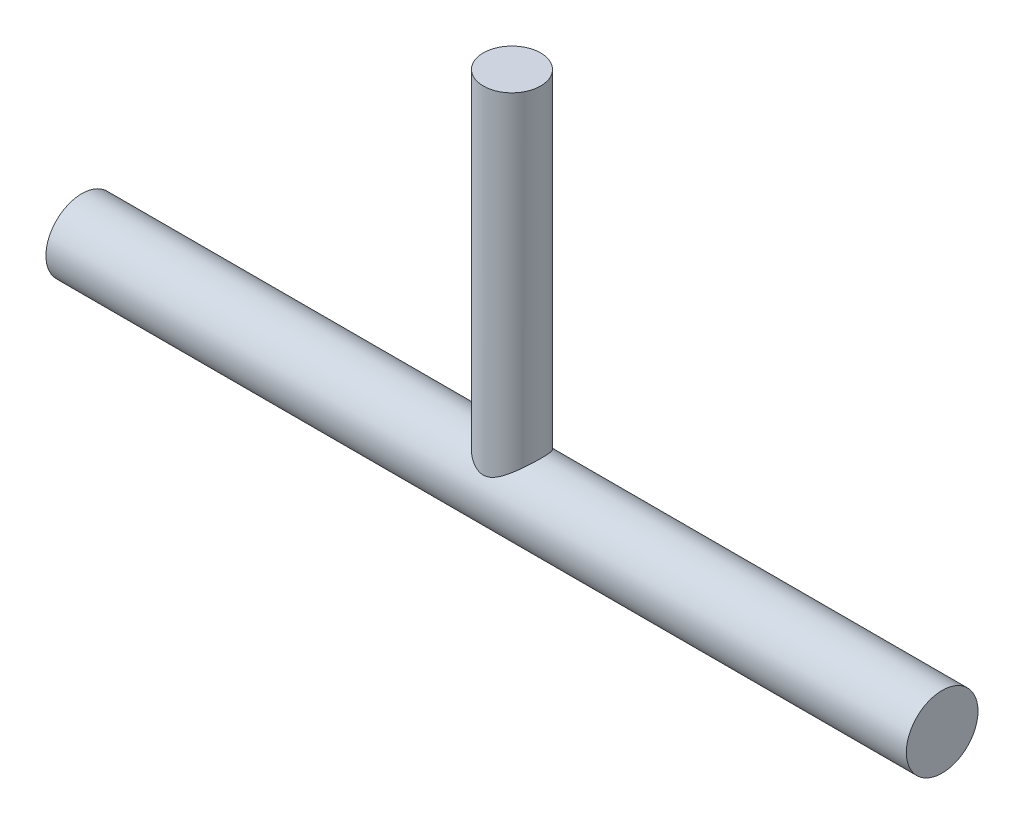
ISO-10303-21;
HEADER;
FILE_DESCRIPTION(('STEP AP214'),'2;1');
FILE_NAME('part.step','',(''),(''),'','','');
FILE_SCHEMA(('AUTOMOTIVE_DESIGN { 1 0 10303 214 1 1 1 1 }'));
ENDSEC;
DATA;
#1=APPLICATION_CONTEXT('core data for automotive mechanical design processes');
#2=APPLICATION_PROTOCOL_DEFINITION('international standard','automotive_design',2000,#1);
#3=PRODUCT_CONTEXT('',#1,'mechanical');
#4=PRODUCT('Part','Part','',(#3));
#5=PRODUCT_RELATED_PRODUCT_CATEGORY('part','',(#4));
#6=PRODUCT_DEFINITION_FORMATION('','',#4);
#7=PRODUCT_DEFINITION_CONTEXT('part definition',#1,'design');
#8=PRODUCT_DEFINITION('design','',#6,#7);
#9=PRODUCT_DEFINITION_SHAPE('','',#8);
#10=(LENGTH_UNIT() NAMED_UNIT(*) SI_UNIT(.MILLI.,.METRE.));
#11=(NAMED_UNIT(*) PLANE_ANGLE_UNIT() SI_UNIT($,.RADIAN.));
#12=(NAMED_UNIT(*) SI_UNIT($,.STERADIAN.) SOLID_ANGLE_UNIT());
#13=UNCERTAINTY_MEASURE_WITH_UNIT(LENGTH_MEASURE(1.E-05),#10,'distance_accuracy_value','');
#14=(GEOMETRIC_REPRESENTATION_CONTEXT(3) GLOBAL_UNCERTAINTY_ASSIGNED_CONTEXT((#13)) GLOBAL_UNIT_ASSIGNED_CONTEXT((#10,
#11,#12)) REPRESENTATION_CONTEXT('',''));
#15=CARTESIAN_POINT('',(0.,0.,0.));
#16=DIRECTION('',(0.,0.,1.));
#17=DIRECTION('',(1.,0.,0.));
#18=AXIS2_PLACEMENT_3D('',#15,#16,#17);
#19=CARTESIAN_POINT('',(120.,0.,0.));
#20=DIRECTION('',(-1.,0.,0.));
#21=DIRECTION('',(0.,0.,1.));
#22=AXIS2_PLACEMENT_3D('',#19,#20,#21);
#23=CYLINDRICAL_SURFACE('',#22,5.);
#24=CARTESIAN_POINT('',(120.,0.,0.));
#25=DIRECTION('',(1.,0.,0.));
#26=DIRECTION('',(0.,0.,-1.));
#27=AXIS2_PLACEMENT_3D('',#24,#25,#26);
#28=CIRCLE('',#27,5.);
#29=CARTESIAN_POINT('',(120.,0.,-5.));
#30=VERTEX_POINT('',#29);
#31=EDGE_CURVE('E46',#30,#30,#28,.T.);
#32=ORIENTED_EDGE('',*,*,#31,.F.);
#33=EDGE_LOOP('',(#32));
#34=FACE_BOUND('',#33,.T.);
#35=CARTESIAN_POINT('',(0.,0.,0.));
#36=DIRECTION('',(1.,0.,0.));
#37=DIRECTION('',(0.,0.,-1.));
#38=AXIS2_PLACEMENT_3D('',#35,#36,#37);
#39=CIRCLE('',#38,5.);
#40=CARTESIAN_POINT('',(0.,0.,-5.));
#41=VERTEX_POINT('',#40);
#42=EDGE_CURVE('E50',#41,#41,#39,.T.);
#43=ORIENTED_EDGE('',*,*,#42,.T.);
#44=EDGE_LOOP('',(#43));
#45=FACE_BOUND('',#44,.T.);
#46=CARTESIAN_POINT('',(60.,3.,-4.));
#47=CARTESIAN_POINT('',(59.9248872361276,3.00000216897706,-3.99999906153736));
#48=CARTESIAN_POINT('',(59.8497451216948,3.00283772099951,-3.9978772461753));
#49=CARTESIAN_POINT('',(59.7000914331377,3.01402583978567,-3.9894472679785));
#50=CARTESIAN_POINT('',(59.6255803240913,3.0223821685803,-3.98313625047582));
#51=CARTESIAN_POINT('',(59.4035207330612,3.05522921920833,-3.95807727295162));
#52=CARTESIAN_POINT('',(59.2577558909747,3.08749551829531,-3.93320424396426));
#53=CARTESIAN_POINT('',(58.9247320703939,3.18155216304268,-3.85777127536566));
#54=CARTESIAN_POINT('',(58.740719237071,3.24971322017135,-3.80127986277752));
#55=CARTESIAN_POINT('',(58.3880594563408,3.40189644530756,-3.66572012951488));
#56=CARTESIAN_POINT('',(58.2194576079596,3.48596308623154,-3.58658817896458));
#57=CARTESIAN_POINT('',(57.9488974194888,3.63299455510025,-3.43637278534429));
#58=CARTESIAN_POINT('',(57.8428274270577,3.69414368347801,-3.37076459378184));
#59=CARTESIAN_POINT('',(57.6376390851311,3.81759266309352,-3.23028207033377));
#60=CARTESIAN_POINT('',(57.5385232508563,3.87989292049062,-3.15540441260616));
#61=CARTESIAN_POINT('',(57.3475301448307,4.00378958470974,-2.99663184861433));
#62=CARTESIAN_POINT('',(57.2556454809063,4.06538665380558,-2.91274636380755));
#63=CARTESIAN_POINT('',(57.0793869814892,4.1863923788989,-2.73598294461541));
#64=CARTESIAN_POINT('',(56.9950141396903,4.24580074475847,-2.64310382389854));
#65=CARTESIAN_POINT('',(56.7858358654578,4.39576497816678,-2.38958702931893));
#66=CARTESIAN_POINT('',(56.6673596004073,4.48348070331291,-2.22188522507707));
#67=CARTESIAN_POINT('',(56.4552559333402,4.64331594269541,-1.86487183658862));
#68=CARTESIAN_POINT('',(56.3615899163312,4.71545966061737,-1.67559449748563));
#69=CARTESIAN_POINT('',(56.2165765830982,4.82831023596969,-1.31063780833639));
#70=CARTESIAN_POINT('',(56.1608355417622,4.87221400973622,-1.13770814774397));
#71=CARTESIAN_POINT('',(56.0730019389452,4.94171895740111,-0.782375130146823));
#72=CARTESIAN_POINT('',(56.0408964442442,4.96733014065903,-0.599977012805124));
#73=CARTESIAN_POINT('',(56.0022839939758,4.99815918603462,-0.230096932996536));
#74=CARTESIAN_POINT('',(55.9958656629139,5.00330644418758,-0.0425996130134274));
#75=CARTESIAN_POINT('',(56.0093284214509,4.99253877415278,0.33083280312679));
#76=CARTESIAN_POINT('',(56.0292107281316,4.97662287125135,0.516767826586743));
#77=CARTESIAN_POINT('',(56.0921359845444,4.92656730161909,0.871367119528875));
#78=CARTESIAN_POINT('',(56.1338576371136,4.89346809374314,1.04042037317327));
#79=CARTESIAN_POINT('',(56.2373904653019,4.81208987661318,1.36834372900709));
#80=CARTESIAN_POINT('',(56.2992067101082,4.76380703714184,1.5272112495601));
#81=CARTESIAN_POINT('',(56.4472013981491,4.6497244388944,1.84705463504236));
#82=CARTESIAN_POINT('',(56.5351530322565,4.58268531292501,2.00675938549037));
#83=CARTESIAN_POINT('',(56.7290757189558,4.43788087321013,2.30941782762205));
#84=CARTESIAN_POINT('',(56.8350568587894,4.36010955958914,2.4523620660043));
#85=CARTESIAN_POINT('',(57.0861237375209,4.18107021951004,2.74853042703121));
#86=CARTESIAN_POINT('',(57.2347672277411,4.07826288579636,2.89780217491636));
#87=CARTESIAN_POINT('',(57.5525118079703,3.8698475585256,3.17076769972647));
#88=CARTESIAN_POINT('',(57.7216377599499,3.76423628533182,3.29442988804259));
#89=CARTESIAN_POINT('',(58.0624403892844,3.56882635257453,3.50457057042853));
#90=CARTESIAN_POINT('',(58.2323018726222,3.47848449125888,3.59348348213152));
#91=CARTESIAN_POINT('',(58.588732941055,3.31164211528199,3.74778213755155));
#92=CARTESIAN_POINT('',(58.7752648718424,3.23511152965085,3.81321930924474));
#93=CARTESIAN_POINT('',(59.1055831863186,3.12787610334288,3.90124400044661));
#94=CARTESIAN_POINT('',(59.245225592082,3.09031204063763,3.93080589266452));
#95=CARTESIAN_POINT('',(59.5303604814662,3.03334609209689,3.97493954411983));
#96=CARTESIAN_POINT('',(59.6758391641014,3.01390372218814,3.98954472407251));
#97=CARTESIAN_POINT('',(59.9697264980981,2.99655581152985,4.00259995644497));
#98=CARTESIAN_POINT('',(60.1181472064763,2.99877509004065,4.00095637919488));
#99=CARTESIAN_POINT('',(60.412095615075,3.0246091025562,3.98145195095297));
#100=CARTESIAN_POINT('',(60.5576189370112,3.04825402601149,3.96356821696024));
#101=CARTESIAN_POINT('',(60.8781218842251,3.12103026774741,3.90662980025043));
#102=CARTESIAN_POINT('',(61.0511776700701,3.17511484339329,3.86334682887901));
#103=CARTESIAN_POINT('',(61.384600654981,3.30045577188711,3.7568227830305));
#104=CARTESIAN_POINT('',(61.544928218338,3.3717631685811,3.69352220593005));
#105=CARTESIAN_POINT('',(61.8109255221089,3.50285579501049,3.56873529200274));
#106=CARTESIAN_POINT('',(61.9196453036444,3.56053707787215,3.5113936535288));
#107=CARTESIAN_POINT('',(62.1304173797933,3.67845509899156,3.38766369294499));
#108=CARTESIAN_POINT('',(62.2324669110478,3.73869287952637,3.32127165613201));
#109=CARTESIAN_POINT('',(62.4299561187522,3.859872019447,3.17963685728911));
#110=CARTESIAN_POINT('',(62.5253891778807,3.92081401406668,3.10438543197556));
#111=CARTESIAN_POINT('',(62.7093472157999,4.04175247615808,2.9452042144371));
#112=CARTESIAN_POINT('',(62.7978732725551,4.10174909000274,2.86127578119157));
#113=CARTESIAN_POINT('',(62.968850939523,4.22021627080502,2.68353213742299));
#114=CARTESIAN_POINT('',(63.0511972233858,4.27865261127786,2.5895923964421));
#115=CARTESIAN_POINT('',(63.2077427948928,4.39166054074384,2.39294409088257));
#116=CARTESIAN_POINT('',(63.2819408075319,4.44623152443022,2.2902341584402));
#117=CARTESIAN_POINT('',(63.4211050204968,4.54992450745379,2.07659269983667));
#118=CARTESIAN_POINT('',(63.486096027297,4.59906106720031,1.96568453999991));
#119=CARTESIAN_POINT('',(63.6059828245744,4.69058814238978,1.73599312724423));
#120=CARTESIAN_POINT('',(63.660884330903,4.73298247555986,1.61721438534432));
#121=CARTESIAN_POINT('',(63.7769341661578,4.82322056507458,1.3291396214626));
#122=CARTESIAN_POINT('',(63.8334221612589,4.86768700006944,1.15683679137342));
#123=CARTESIAN_POINT('',(63.9228768529878,4.93844243001732,0.802710516835252));
#124=CARTESIAN_POINT('',(63.9558615051709,4.96474530068643,0.620894454329596));
#125=CARTESIAN_POINT('',(63.9963822598593,4.99709091896648,0.251928169863223));
#126=CARTESIAN_POINT('',(64.0038255067254,5.00305974169112,0.0647609739930181));
#127=CARTESIAN_POINT('',(63.9924678849242,4.99397521901685,-0.308260451752381));
#128=CARTESIAN_POINT('',(63.9736651683022,4.97892039336181,-0.494114588250199));
#129=CARTESIAN_POINT('',(63.91279269274,4.9304799780731,-0.848969594728799));
#130=CARTESIAN_POINT('',(63.8720213170667,4.89811800019639,-1.01834018003764));
#131=CARTESIAN_POINT('',(63.7702931775047,4.81810404518646,-1.34704122291859));
#132=CARTESIAN_POINT('',(63.7093311856992,4.77044810811758,-1.50636906741201));
#133=CARTESIAN_POINT('',(63.5632510562057,4.65772424604643,-1.82676698607757));
#134=CARTESIAN_POINT('',(63.4764129467816,4.59144870858767,-1.98661951413852));
#135=CARTESIAN_POINT('',(63.2847146944691,4.44806715123531,-2.28972858505142));
#136=CARTESIAN_POINT('',(63.1798449829738,4.37095538500458,-2.43297624848929));
#137=CARTESIAN_POINT('',(62.931410442207,4.19334053560394,-2.72976152486729));
#138=CARTESIAN_POINT('',(62.7843189041257,4.09128024292157,-2.87940400752525));
#139=CARTESIAN_POINT('',(62.4697544047085,3.8840119778562,-3.15339914395294));
#140=CARTESIAN_POINT('',(62.3022562115179,3.77880023252429,-3.2777199709751));
#141=CARTESIAN_POINT('',(62.0435346368876,3.62927982065268,-3.43993958125246));
#142=CARTESIAN_POINT('',(61.9599800298985,3.58277064491091,-3.488247591851));
#143=CARTESIAN_POINT('',(61.788647409926,3.49198784457615,-3.57912761543908));
#144=CARTESIAN_POINT('',(61.7008688342657,3.44771451944073,-3.62169886134499));
#145=CARTESIAN_POINT('',(61.4313213159297,3.32016981870037,-3.74029659813686));
#146=CARTESIAN_POINT('',(61.2429248328653,3.24192092894644,-3.80747088284747));
#147=CARTESIAN_POINT('',(60.9076619383188,3.13160451168613,-3.89828691275497));
#148=CARTESIAN_POINT('',(60.7650105330504,3.09272315846936,-3.92892882070587));
#149=CARTESIAN_POINT('',(60.5465916738092,3.04855095693217,-3.96316402261262));
#150=CARTESIAN_POINT('',(60.4731401003299,3.0361918739199,-3.97261660358216));
#151=CARTESIAN_POINT('',(60.3251615289044,3.01668227593599,-3.98745340408319));
#152=CARTESIAN_POINT('',(60.2506353213218,3.00952811408349,-3.99284047225642));
#153=CARTESIAN_POINT('',(60.146618179322,3.00343793345697,-3.99741959341137));
#154=CARTESIAN_POINT('',(60.1173211933812,3.00215019354812,-3.99838660813179));
#155=CARTESIAN_POINT('',(60.0586843015537,3.00043074741308,-3.99967703663994));
#156=CARTESIAN_POINT('',(60.0293443905761,2.99999915264322,-4.00000036663029));
#157=CARTESIAN_POINT('',(60.,3.,-4.));
#158=B_SPLINE_CURVE_WITH_KNOTS('',3,(#46,#47,#48,#49,#50,#51,#52,#53,#54,#55,#56,#57,#58,#59,
#60,#61,#62,#63,#64,#65,#66,#67,#68,#69,#70,#71,#72,#73,#74,#75,#76,#77,#78,#79,#80,#81,#82,#83,
#84,#85,#86,#87,#88,#89,#90,#91,#92,#93,#94,#95,#96,#97,#98,#99,#100,#101,#102,#103,#104,#105,
#106,#107,#108,#109,#110,#111,#112,#113,#114,#115,#116,#117,#118,#119,#120,#121,#122,#123,#124,
#125,#126,#127,#128,#129,#130,#131,#132,#133,#134,#135,#136,#137,#138,#139,#140,#141,#142,#143,
#144,#145,#146,#147,#148,#149,#150,#151,#152,#153,#154,#155,#156,#157),.UNSPECIFIED.,.T.,.F.,(4,
2,2,2,2,2,2,2,2,2,2,2,2,2,2,2,2,2,2,2,2,2,2,2,2,2,2,2,2,2,2,2,2,2,2,2,2,2,2,2,2,2,2,2,2,2,2,2,2,
2,2,2,2,2,2,4),(0.,0.225303149807234,0.450759986838272,0.902589537001556,1.51190711853316,
2.12295426111056,2.53921883623536,2.95563320042537,3.37161619465101,3.78765413525725,
4.45477512810166,5.12085162154028,5.67923095322337,6.23730451573862,6.79730186307842,
7.35732512562407,7.88682741454582,8.41646338281239,8.99711927828841,9.57810111704287,
10.2788135954479,10.9803852999411,11.6143729322192,12.2469630912607,12.6881435902171,
13.1283361077291,13.5710666035102,14.0144218930567,14.5705602720657,15.1283675704704,
15.5352238321967,15.942247592246,16.3496727250838,16.7570341440244,17.1702378198688,
17.5835060601354,17.9956387441516,18.4075372242805,18.9651425713465,19.5223214735684,
20.0815238628587,20.6407656270703,21.1700928587455,21.6995572553744,22.2782911959238,
22.8573331992422,23.5548944002191,24.2533270266164,24.5745079263911,24.8957317299052,
25.5365329660934,25.9876445768305,26.2126360623764,26.4374697531347,26.5254777394982,
26.6134971823349),.UNSPECIFIED.);
#159=CARTESIAN_POINT('',(60.,3.,-4.));
#160=VERTEX_POINT('',#159);
#161=EDGE_CURVE('E10',#160,#160,#158,.T.);
#162=ORIENTED_EDGE('',*,*,#161,.F.);
#163=EDGE_LOOP('',(#162));
#164=FACE_BOUND('',#163,.T.);
#165=ADVANCED_FACE('F35',(#34,#45,#164),#23,.T.);
#166=CARTESIAN_POINT('',(120.,0.,0.));
#167=DIRECTION('',(1.,0.,0.));
#168=DIRECTION('',(0.,0.,-1.));
#169=AXIS2_PLACEMENT_3D('',#166,#167,#168);
#170=PLANE('',#169);
#171=ORIENTED_EDGE('',*,*,#31,.T.);
#172=EDGE_LOOP('',(#171));
#173=FACE_BOUND('',#172,.T.);
#174=ADVANCED_FACE('F70',(#173),#170,.T.);
#175=CARTESIAN_POINT('',(0.,0.,0.));
#176=DIRECTION('',(1.,0.,0.));
#177=DIRECTION('',(0.,0.,-1.));
#178=AXIS2_PLACEMENT_3D('',#175,#176,#177);
#179=PLANE('',#178);
#180=ORIENTED_EDGE('',*,*,#42,.F.);
#181=EDGE_LOOP('',(#180));
#182=FACE_BOUND('',#181,.T.);
#183=ADVANCED_FACE('F64',(#182),#179,.F.);
#184=CARTESIAN_POINT('',(60.,50.,0.));
#185=DIRECTION('',(0.,-1.,0.));
#186=DIRECTION('',(0.,0.,-1.));
#187=AXIS2_PLACEMENT_3D('',#184,#185,#186);
#188=CYLINDRICAL_SURFACE('',#187,4.);
#189=CARTESIAN_POINT('',(60.,50.,0.));
#190=DIRECTION('',(0.,1.,0.));
#191=DIRECTION('',(0.,0.,1.));
#192=AXIS2_PLACEMENT_3D('',#189,#190,#191);
#193=CIRCLE('',#192,4.);
#194=CARTESIAN_POINT('',(60.,50.,4.));
#195=VERTEX_POINT('',#194);
#196=EDGE_CURVE('E55',#195,#195,#193,.T.);
#197=ORIENTED_EDGE('',*,*,#196,.F.);
#198=EDGE_LOOP('',(#197));
#199=FACE_BOUND('',#198,.T.);
#200=ORIENTED_EDGE('',*,*,#161,.T.);
#201=EDGE_LOOP('',(#200));
#202=FACE_BOUND('',#201,.T.);
#203=ADVANCED_FACE('F62',(#199,#202),#188,.T.);
#204=CARTESIAN_POINT('',(60.,50.,0.));
#205=DIRECTION('',(0.,1.,0.));
#206=DIRECTION('',(0.,0.,1.));
#207=AXIS2_PLACEMENT_3D('',#204,#205,#206);
#208=PLANE('',#207);
#209=ORIENTED_EDGE('',*,*,#196,.T.);
#210=EDGE_LOOP('',(#209));
#211=FACE_BOUND('',#210,.T.);
#212=ADVANCED_FACE('F60',(#211),#208,.T.);
#213=CLOSED_SHELL('',(#165,#174,#183,#203,#212));
#214=MANIFOLD_SOLID_BREP('B2',#213);
#215=ADVANCED_BREP_SHAPE_REPRESENTATION('',(#18,#214),#14);
#216=SHAPE_DEFINITION_REPRESENTATION(#9,#215);
ENDSEC;
END-ISO-10303-21;
